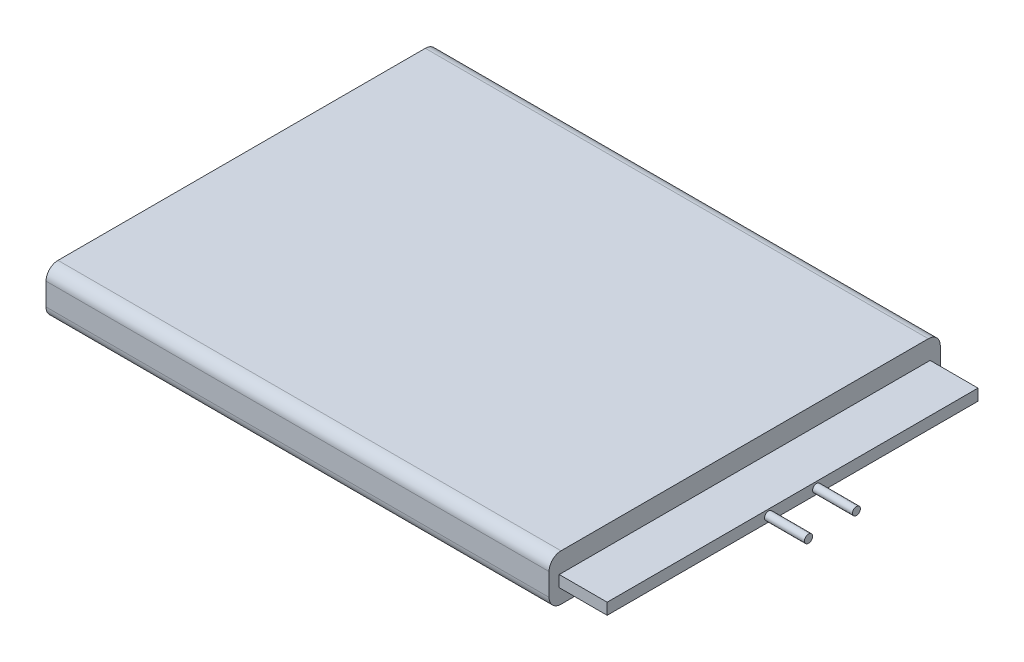
ISO-10303-21;
HEADER;
FILE_DESCRIPTION(('STEP AP214'),'2;1');
FILE_NAME('part.step','',(''),(''),'','','');
FILE_SCHEMA(('AUTOMOTIVE_DESIGN { 1 0 10303 214 1 1 1 1 }'));
ENDSEC;
DATA;
#1=APPLICATION_CONTEXT('core data for automotive mechanical design processes');
#2=APPLICATION_PROTOCOL_DEFINITION('international standard','automotive_design',2000,#1);
#3=PRODUCT_CONTEXT('',#1,'mechanical');
#4=PRODUCT('Part','Part','',(#3));
#5=PRODUCT_RELATED_PRODUCT_CATEGORY('part','',(#4));
#6=PRODUCT_DEFINITION_FORMATION('','',#4);
#7=PRODUCT_DEFINITION_CONTEXT('part definition',#1,'design');
#8=PRODUCT_DEFINITION('design','',#6,#7);
#9=PRODUCT_DEFINITION_SHAPE('','',#8);
#10=(LENGTH_UNIT() NAMED_UNIT(*) SI_UNIT(.MILLI.,.METRE.));
#11=(NAMED_UNIT(*) PLANE_ANGLE_UNIT() SI_UNIT($,.RADIAN.));
#12=(NAMED_UNIT(*) SI_UNIT($,.STERADIAN.) SOLID_ANGLE_UNIT());
#13=UNCERTAINTY_MEASURE_WITH_UNIT(LENGTH_MEASURE(1.E-05),#10,'distance_accuracy_value','');
#14=(GEOMETRIC_REPRESENTATION_CONTEXT(3) GLOBAL_UNCERTAINTY_ASSIGNED_CONTEXT((#13)) GLOBAL_UNIT_ASSIGNED_CONTEXT((#10,
#11,#12)) REPRESENTATION_CONTEXT('',''));
#15=CARTESIAN_POINT('',(0.,0.,0.));
#16=DIRECTION('',(0.,0.,1.));
#17=DIRECTION('',(1.,0.,0.));
#18=AXIS2_PLACEMENT_3D('',#15,#16,#17);
#19=CARTESIAN_POINT('',(63.,5.8,0.));
#20=DIRECTION('',(-1.,0.,0.));
#21=DIRECTION('',(0.,0.,1.));
#22=AXIS2_PLACEMENT_3D('',#19,#20,#21);
#23=PLANE('',#22);
#24=DIRECTION('',(0.,0.,-1.));
#25=VECTOR('',#24,1.);
#26=CARTESIAN_POINT('',(63.,0.,0.));
#27=LINE('',#26,#25);
#28=CARTESIAN_POINT('',(63.,0.,-1.5));
#29=VERTEX_POINT('',#28);
#30=CARTESIAN_POINT('',(63.,0.,-47.5));
#31=VERTEX_POINT('',#30);
#32=EDGE_CURVE('E144',#29,#31,#27,.T.);
#33=ORIENTED_EDGE('',*,*,#32,.T.);
#34=CARTESIAN_POINT('',(63.,1.5,-47.5));
#35=DIRECTION('',(-1.,0.,0.));
#36=DIRECTION('',(0.,0.,1.));
#37=AXIS2_PLACEMENT_3D('',#34,#35,#36);
#38=CIRCLE('',#37,1.5);
#39=CARTESIAN_POINT('',(63.,1.5,-49.));
#40=VERTEX_POINT('',#39);
#41=EDGE_CURVE('E193',#31,#40,#38,.F.);
#42=ORIENTED_EDGE('',*,*,#41,.T.);
#43=DIRECTION('',(0.,-1.,0.));
#44=VECTOR('',#43,1.);
#45=CARTESIAN_POINT('',(63.,5.8,-49.));
#46=LINE('',#45,#44);
#47=CARTESIAN_POINT('',(63.,4.3,-49.));
#48=VERTEX_POINT('',#47);
#49=EDGE_CURVE('E161',#48,#40,#46,.T.);
#50=ORIENTED_EDGE('',*,*,#49,.F.);
#51=CARTESIAN_POINT('',(63.,4.3,-47.5));
#52=DIRECTION('',(-1.,0.,0.));
#53=DIRECTION('',(0.,0.,1.));
#54=AXIS2_PLACEMENT_3D('',#51,#52,#53);
#55=CIRCLE('',#54,1.5);
#56=CARTESIAN_POINT('',(63.,5.8,-47.5));
#57=VERTEX_POINT('',#56);
#58=EDGE_CURVE('E191',#48,#57,#55,.F.);
#59=ORIENTED_EDGE('',*,*,#58,.T.);
#60=DIRECTION('',(0.,0.,-1.));
#61=VECTOR('',#60,1.);
#62=CARTESIAN_POINT('',(63.,5.8,0.));
#63=LINE('',#62,#61);
#64=CARTESIAN_POINT('',(63.,5.8,-1.5));
#65=VERTEX_POINT('',#64);
#66=EDGE_CURVE('E153',#65,#57,#63,.T.);
#67=ORIENTED_EDGE('',*,*,#66,.F.);
#68=CARTESIAN_POINT('',(63.,4.3,-1.5));
#69=DIRECTION('',(-1.,0.,0.));
#70=DIRECTION('',(0.,0.,1.));
#71=AXIS2_PLACEMENT_3D('',#68,#69,#70);
#72=CIRCLE('',#71,1.5);
#73=CARTESIAN_POINT('',(63.,4.3,0.));
#74=VERTEX_POINT('',#73);
#75=EDGE_CURVE('E187',#65,#74,#72,.F.);
#76=ORIENTED_EDGE('',*,*,#75,.T.);
#77=DIRECTION('',(0.,-1.,0.));
#78=VECTOR('',#77,1.);
#79=CARTESIAN_POINT('',(63.,5.8,0.));
#80=LINE('',#79,#78);
#81=CARTESIAN_POINT('',(63.,1.5,0.));
#82=VERTEX_POINT('',#81);
#83=EDGE_CURVE('E164',#74,#82,#80,.T.);
#84=ORIENTED_EDGE('',*,*,#83,.T.);
#85=CARTESIAN_POINT('',(63.,1.5,-1.5));
#86=DIRECTION('',(-1.,0.,0.));
#87=DIRECTION('',(0.,0.,1.));
#88=AXIS2_PLACEMENT_3D('',#85,#86,#87);
#89=CIRCLE('',#88,1.5);
#90=EDGE_CURVE('E189',#82,#29,#89,.F.);
#91=ORIENTED_EDGE('',*,*,#90,.T.);
#92=EDGE_LOOP('',(#33,#42,#50,#59,#67,#76,#84,#91));
#93=FACE_BOUND('',#92,.T.);
#94=DIRECTION('',(0.,1.,0.));
#95=VECTOR('',#94,1.);
#96=CARTESIAN_POINT('',(63.,3.33590435886056,-47.7218140265596));
#97=LINE('',#96,#95);
#98=CARTESIAN_POINT('',(63.,1.90930827531764,-47.7218140265596));
#99=VERTEX_POINT('',#98);
#100=CARTESIAN_POINT('',(63.,3.33590435886056,-47.7218140265596));
#101=VERTEX_POINT('',#100);
#102=EDGE_CURVE('E47',#99,#101,#97,.T.);
#103=ORIENTED_EDGE('',*,*,#102,.F.);
#104=DIRECTION('',(0.,0.,-1.));
#105=VECTOR('',#104,1.);
#106=CARTESIAN_POINT('',(63.,1.90930827531764,-1.2781859734404));
#107=LINE('',#106,#105);
#108=CARTESIAN_POINT('',(63.,1.90930827531764,-1.2781859734404));
#109=VERTEX_POINT('',#108);
#110=EDGE_CURVE('E51',#109,#99,#107,.T.);
#111=ORIENTED_EDGE('',*,*,#110,.F.);
#112=DIRECTION('',(0.,-1.,0.));
#113=VECTOR('',#112,1.);
#114=CARTESIAN_POINT('',(63.,3.33590435886056,-1.2781859734404));
#115=LINE('',#114,#113);
#116=CARTESIAN_POINT('',(63.,3.33590435886056,-1.2781859734404));
#117=VERTEX_POINT('',#116);
#118=EDGE_CURVE('E316',#117,#109,#115,.T.);
#119=ORIENTED_EDGE('',*,*,#118,.F.);
#120=DIRECTION('',(0.,0.,1.));
#121=VECTOR('',#120,1.);
#122=CARTESIAN_POINT('',(63.,3.33590435886056,-1.2781859734404));
#123=LINE('',#122,#121);
#124=EDGE_CURVE('E314',#101,#117,#123,.T.);
#125=ORIENTED_EDGE('',*,*,#124,.F.);
#126=EDGE_LOOP('',(#103,#111,#119,#125));
#127=FACE_BOUND('',#126,.T.);
#128=ADVANCED_FACE('F32',(#93,#127),#23,.F.);
#129=CARTESIAN_POINT('',(0.,5.8,0.));
#130=DIRECTION('',(1.,0.,0.));
#131=DIRECTION('',(0.,0.,-1.));
#132=AXIS2_PLACEMENT_3D('',#129,#130,#131);
#133=PLANE('',#132);
#134=DIRECTION('',(0.,-1.,0.));
#135=VECTOR('',#134,1.);
#136=CARTESIAN_POINT('',(0.,5.8,-49.));
#137=LINE('',#136,#135);
#138=CARTESIAN_POINT('',(0.,4.3,-49.));
#139=VERTEX_POINT('',#138);
#140=CARTESIAN_POINT('',(0.,1.5,-49.));
#141=VERTEX_POINT('',#140);
#142=EDGE_CURVE('E155',#139,#141,#137,.T.);
#143=ORIENTED_EDGE('',*,*,#142,.T.);
#144=CARTESIAN_POINT('',(0.,1.5,-47.5));
#145=DIRECTION('',(1.,0.,0.));
#146=DIRECTION('',(0.,0.,-1.));
#147=AXIS2_PLACEMENT_3D('',#144,#145,#146);
#148=CIRCLE('',#147,1.5);
#149=CARTESIAN_POINT('',(0.,0.,-47.5));
#150=VERTEX_POINT('',#149);
#151=EDGE_CURVE('E181',#141,#150,#148,.F.);
#152=ORIENTED_EDGE('',*,*,#151,.T.);
#153=DIRECTION('',(0.,0.,1.));
#154=VECTOR('',#153,1.);
#155=CARTESIAN_POINT('',(0.,0.,0.));
#156=LINE('',#155,#154);
#157=CARTESIAN_POINT('',(0.,0.,-1.5));
#158=VERTEX_POINT('',#157);
#159=EDGE_CURVE('E141',#150,#158,#156,.T.);
#160=ORIENTED_EDGE('',*,*,#159,.T.);
#161=CARTESIAN_POINT('',(0.,1.5,-1.5));
#162=DIRECTION('',(1.,0.,0.));
#163=DIRECTION('',(0.,0.,-1.));
#164=AXIS2_PLACEMENT_3D('',#161,#162,#163);
#165=CIRCLE('',#164,1.5);
#166=CARTESIAN_POINT('',(0.,1.5,0.));
#167=VERTEX_POINT('',#166);
#168=EDGE_CURVE('E177',#158,#167,#165,.F.);
#169=ORIENTED_EDGE('',*,*,#168,.T.);
#170=DIRECTION('',(0.,-1.,0.));
#171=VECTOR('',#170,1.);
#172=CARTESIAN_POINT('',(0.,5.8,0.));
#173=LINE('',#172,#171);
#174=CARTESIAN_POINT('',(0.,4.3,0.));
#175=VERTEX_POINT('',#174);
#176=EDGE_CURVE('E167',#175,#167,#173,.T.);
#177=ORIENTED_EDGE('',*,*,#176,.F.);
#178=CARTESIAN_POINT('',(0.,4.3,-1.5));
#179=DIRECTION('',(1.,0.,0.));
#180=DIRECTION('',(0.,0.,-1.));
#181=AXIS2_PLACEMENT_3D('',#178,#179,#180);
#182=CIRCLE('',#181,1.5);
#183=CARTESIAN_POINT('',(0.,5.8,-1.5));
#184=VERTEX_POINT('',#183);
#185=EDGE_CURVE('E175',#175,#184,#182,.F.);
#186=ORIENTED_EDGE('',*,*,#185,.T.);
#187=DIRECTION('',(0.,0.,1.));
#188=VECTOR('',#187,1.);
#189=CARTESIAN_POINT('',(0.,5.8,0.));
#190=LINE('',#189,#188);
#191=CARTESIAN_POINT('',(0.,5.8,-47.5));
#192=VERTEX_POINT('',#191);
#193=EDGE_CURVE('E150',#192,#184,#190,.T.);
#194=ORIENTED_EDGE('',*,*,#193,.F.);
#195=CARTESIAN_POINT('',(0.,4.3,-47.5));
#196=DIRECTION('',(1.,0.,0.));
#197=DIRECTION('',(0.,0.,-1.));
#198=AXIS2_PLACEMENT_3D('',#195,#196,#197);
#199=CIRCLE('',#198,1.5);
#200=EDGE_CURVE('E179',#192,#139,#199,.F.);
#201=ORIENTED_EDGE('',*,*,#200,.T.);
#202=EDGE_LOOP('',(#143,#152,#160,#169,#177,#186,#194,#201));
#203=FACE_BOUND('',#202,.T.);
#204=ADVANCED_FACE('F209',(#203),#133,.F.);
#205=CARTESIAN_POINT('',(0.,5.8,0.));
#206=DIRECTION('',(0.,0.,-1.));
#207=DIRECTION('',(-1.,0.,0.));
#208=AXIS2_PLACEMENT_3D('',#205,#206,#207);
#209=PLANE('',#208);
#210=ORIENTED_EDGE('',*,*,#176,.T.);
#211=DIRECTION('',(1.,0.,0.));
#212=VECTOR('',#211,1.);
#213=CARTESIAN_POINT('',(63.,1.5,0.));
#214=LINE('',#213,#212);
#215=EDGE_CURVE('E11',#167,#82,#214,.T.);
#216=ORIENTED_EDGE('',*,*,#215,.T.);
#217=ORIENTED_EDGE('',*,*,#83,.F.);
#218=DIRECTION('',(1.,0.,0.));
#219=VECTOR('',#218,1.);
#220=CARTESIAN_POINT('',(0.,4.3,0.));
#221=LINE('',#220,#219);
#222=EDGE_CURVE('E40',#74,#175,#221,.F.);
#223=ORIENTED_EDGE('',*,*,#222,.T.);
#224=EDGE_LOOP('',(#210,#216,#217,#223));
#225=FACE_BOUND('',#224,.T.);
#226=ADVANCED_FACE('F204',(#225),#209,.F.);
#227=CARTESIAN_POINT('',(0.,5.8,-49.));
#228=DIRECTION('',(0.,0.,1.));
#229=DIRECTION('',(1.,0.,0.));
#230=AXIS2_PLACEMENT_3D('',#227,#228,#229);
#231=PLANE('',#230);
#232=ORIENTED_EDGE('',*,*,#49,.T.);
#233=DIRECTION('',(-1.,0.,0.));
#234=VECTOR('',#233,1.);
#235=CARTESIAN_POINT('',(0.,1.5,-49.));
#236=LINE('',#235,#234);
#237=EDGE_CURVE('E172',#40,#141,#236,.T.);
#238=ORIENTED_EDGE('',*,*,#237,.T.);
#239=ORIENTED_EDGE('',*,*,#142,.F.);
#240=DIRECTION('',(-1.,0.,0.));
#241=VECTOR('',#240,1.);
#242=CARTESIAN_POINT('',(0.,4.3,-49.));
#243=LINE('',#242,#241);
#244=EDGE_CURVE('E170',#139,#48,#243,.F.);
#245=ORIENTED_EDGE('',*,*,#244,.T.);
#246=EDGE_LOOP('',(#232,#238,#239,#245));
#247=FACE_BOUND('',#246,.T.);
#248=ADVANCED_FACE('F225',(#247),#231,.F.);
#249=CARTESIAN_POINT('',(0.,5.8,0.));
#250=DIRECTION('',(0.,-1.,0.));
#251=DIRECTION('',(0.,0.,-1.));
#252=AXIS2_PLACEMENT_3D('',#249,#250,#251);
#253=PLANE('',#252);
#254=ORIENTED_EDGE('',*,*,#66,.T.);
#255=DIRECTION('',(-1.,0.,0.));
#256=VECTOR('',#255,1.);
#257=CARTESIAN_POINT('',(0.,5.8,-47.5));
#258=LINE('',#257,#256);
#259=EDGE_CURVE('E198',#57,#192,#258,.T.);
#260=ORIENTED_EDGE('',*,*,#259,.T.);
#261=ORIENTED_EDGE('',*,*,#193,.T.);
#262=DIRECTION('',(1.,0.,0.));
#263=VECTOR('',#262,1.);
#264=CARTESIAN_POINT('',(0.,5.8,-1.5));
#265=LINE('',#264,#263);
#266=EDGE_CURVE('E195',#184,#65,#265,.T.);
#267=ORIENTED_EDGE('',*,*,#266,.T.);
#268=EDGE_LOOP('',(#254,#260,#261,#267));
#269=FACE_BOUND('',#268,.T.);
#270=ADVANCED_FACE('F215',(#269),#253,.F.);
#271=CARTESIAN_POINT('',(0.,0.,0.));
#272=DIRECTION('',(0.,-1.,0.));
#273=DIRECTION('',(0.,0.,-1.));
#274=AXIS2_PLACEMENT_3D('',#271,#272,#273);
#275=PLANE('',#274);
#276=ORIENTED_EDGE('',*,*,#159,.F.);
#277=DIRECTION('',(-1.,0.,0.));
#278=VECTOR('',#277,1.);
#279=CARTESIAN_POINT('',(63.,0.,-47.5));
#280=LINE('',#279,#278);
#281=EDGE_CURVE('E185',#150,#31,#280,.F.);
#282=ORIENTED_EDGE('',*,*,#281,.T.);
#283=ORIENTED_EDGE('',*,*,#32,.F.);
#284=DIRECTION('',(1.,0.,0.));
#285=VECTOR('',#284,1.);
#286=CARTESIAN_POINT('',(0.,0.,-1.5));
#287=LINE('',#286,#285);
#288=EDGE_CURVE('E183',#29,#158,#287,.F.);
#289=ORIENTED_EDGE('',*,*,#288,.T.);
#290=EDGE_LOOP('',(#276,#282,#283,#289));
#291=FACE_BOUND('',#290,.T.);
#292=ADVANCED_FACE('F233',(#291),#275,.T.);
#293=CARTESIAN_POINT('',(0.,1.5,-47.5));
#294=DIRECTION('',(1.,0.,0.));
#295=DIRECTION('',(0.,0.,-1.));
#296=AXIS2_PLACEMENT_3D('',#293,#294,#295);
#297=CYLINDRICAL_SURFACE('',#296,1.5);
#298=ORIENTED_EDGE('',*,*,#41,.F.);
#299=ORIENTED_EDGE('',*,*,#281,.F.);
#300=ORIENTED_EDGE('',*,*,#151,.F.);
#301=ORIENTED_EDGE('',*,*,#237,.F.);
#302=EDGE_LOOP('',(#298,#299,#300,#301));
#303=FACE_BOUND('',#302,.T.);
#304=ADVANCED_FACE('F229',(#303),#297,.T.);
#305=CARTESIAN_POINT('',(0.,4.3,-47.5));
#306=DIRECTION('',(-1.,0.,0.));
#307=DIRECTION('',(0.,0.,1.));
#308=AXIS2_PLACEMENT_3D('',#305,#306,#307);
#309=CYLINDRICAL_SURFACE('',#308,1.5);
#310=ORIENTED_EDGE('',*,*,#58,.F.);
#311=ORIENTED_EDGE('',*,*,#244,.F.);
#312=ORIENTED_EDGE('',*,*,#200,.F.);
#313=ORIENTED_EDGE('',*,*,#259,.F.);
#314=EDGE_LOOP('',(#310,#311,#312,#313));
#315=FACE_BOUND('',#314,.T.);
#316=ADVANCED_FACE('F222',(#315),#309,.T.);
#317=CARTESIAN_POINT('',(0.,1.5,-1.5));
#318=DIRECTION('',(-1.,0.,0.));
#319=DIRECTION('',(0.,0.,1.));
#320=AXIS2_PLACEMENT_3D('',#317,#318,#319);
#321=CYLINDRICAL_SURFACE('',#320,1.5);
#322=ORIENTED_EDGE('',*,*,#168,.F.);
#323=ORIENTED_EDGE('',*,*,#288,.F.);
#324=ORIENTED_EDGE('',*,*,#90,.F.);
#325=ORIENTED_EDGE('',*,*,#215,.F.);
#326=EDGE_LOOP('',(#322,#323,#324,#325));
#327=FACE_BOUND('',#326,.T.);
#328=ADVANCED_FACE('F237',(#327),#321,.T.);
#329=CARTESIAN_POINT('',(0.,4.3,-1.5));
#330=DIRECTION('',(1.,0.,0.));
#331=DIRECTION('',(0.,0.,-1.));
#332=AXIS2_PLACEMENT_3D('',#329,#330,#331);
#333=CYLINDRICAL_SURFACE('',#332,1.5);
#334=ORIENTED_EDGE('',*,*,#185,.F.);
#335=ORIENTED_EDGE('',*,*,#222,.F.);
#336=ORIENTED_EDGE('',*,*,#75,.F.);
#337=ORIENTED_EDGE('',*,*,#266,.F.);
#338=EDGE_LOOP('',(#334,#335,#336,#337));
#339=FACE_BOUND('',#338,.T.);
#340=ADVANCED_FACE('F34',(#339),#333,.T.);
#341=CARTESIAN_POINT('',(69.,3.33590435886056,-47.7218140265596));
#342=DIRECTION('',(0.,0.,1.));
#343=DIRECTION('',(1.,0.,0.));
#344=AXIS2_PLACEMENT_3D('',#341,#342,#343);
#345=PLANE('',#344);
#346=ORIENTED_EDGE('',*,*,#102,.T.);
#347=DIRECTION('',(-1.,0.,0.));
#348=VECTOR('',#347,1.);
#349=CARTESIAN_POINT('',(69.,3.33590435886056,-47.7218140265596));
#350=LINE('',#349,#348);
#351=CARTESIAN_POINT('',(69.,3.33590435886056,-47.7218140265596));
#352=VERTEX_POINT('',#351);
#353=EDGE_CURVE('E124',#352,#101,#350,.T.);
#354=ORIENTED_EDGE('',*,*,#353,.F.);
#355=DIRECTION('',(0.,1.,0.));
#356=VECTOR('',#355,1.);
#357=CARTESIAN_POINT('',(69.,3.33590435886056,-47.7218140265596));
#358=LINE('',#357,#356);
#359=CARTESIAN_POINT('',(69.,1.90930827531764,-47.7218140265596));
#360=VERTEX_POINT('',#359);
#361=EDGE_CURVE('E130',#360,#352,#358,.T.);
#362=ORIENTED_EDGE('',*,*,#361,.F.);
#363=DIRECTION('',(-1.,0.,0.));
#364=VECTOR('',#363,1.);
#365=CARTESIAN_POINT('',(69.,1.90930827531764,-47.7218140265596));
#366=LINE('',#365,#364);
#367=EDGE_CURVE('E312',#360,#99,#366,.T.);
#368=ORIENTED_EDGE('',*,*,#367,.T.);
#369=EDGE_LOOP('',(#346,#354,#362,#368));
#370=FACE_BOUND('',#369,.T.);
#371=ADVANCED_FACE('F140',(#370),#345,.F.);
#372=CARTESIAN_POINT('',(69.,3.33590435886056,-1.2781859734404));
#373=DIRECTION('',(0.,-1.,0.));
#374=DIRECTION('',(0.,0.,-1.));
#375=AXIS2_PLACEMENT_3D('',#372,#373,#374);
#376=PLANE('',#375);
#377=ORIENTED_EDGE('',*,*,#124,.T.);
#378=DIRECTION('',(-1.,0.,0.));
#379=VECTOR('',#378,1.);
#380=CARTESIAN_POINT('',(69.,3.33590435886056,-1.2781859734404));
#381=LINE('',#380,#379);
#382=CARTESIAN_POINT('',(69.,3.33590435886056,-1.2781859734404));
#383=VERTEX_POINT('',#382);
#384=EDGE_CURVE('E126',#383,#117,#381,.T.);
#385=ORIENTED_EDGE('',*,*,#384,.F.);
#386=DIRECTION('',(0.,0.,1.));
#387=VECTOR('',#386,1.);
#388=CARTESIAN_POINT('',(69.,3.33590435886056,-1.2781859734404));
#389=LINE('',#388,#387);
#390=EDGE_CURVE('E119',#352,#383,#389,.T.);
#391=ORIENTED_EDGE('',*,*,#390,.F.);
#392=ORIENTED_EDGE('',*,*,#353,.T.);
#393=EDGE_LOOP('',(#377,#385,#391,#392));
#394=FACE_BOUND('',#393,.T.);
#395=ADVANCED_FACE('F122',(#394),#376,.F.);
#396=CARTESIAN_POINT('',(69.,3.33590435886056,-1.2781859734404));
#397=DIRECTION('',(0.,0.,-1.));
#398=DIRECTION('',(0.,1.,0.));
#399=AXIS2_PLACEMENT_3D('',#396,#397,#398);
#400=PLANE('',#399);
#401=ORIENTED_EDGE('',*,*,#118,.T.);
#402=DIRECTION('',(-1.,0.,0.));
#403=VECTOR('',#402,1.);
#404=CARTESIAN_POINT('',(69.,1.90930827531764,-1.2781859734404));
#405=LINE('',#404,#403);
#406=CARTESIAN_POINT('',(69.,1.90930827531764,-1.2781859734404));
#407=VERTEX_POINT('',#406);
#408=EDGE_CURVE('E146',#407,#109,#405,.T.);
#409=ORIENTED_EDGE('',*,*,#408,.F.);
#410=DIRECTION('',(0.,-1.,0.));
#411=VECTOR('',#410,1.);
#412=CARTESIAN_POINT('',(69.,3.33590435886056,-1.2781859734404));
#413=LINE('',#412,#411);
#414=EDGE_CURVE('E129',#383,#407,#413,.T.);
#415=ORIENTED_EDGE('',*,*,#414,.F.);
#416=ORIENTED_EDGE('',*,*,#384,.T.);
#417=EDGE_LOOP('',(#401,#409,#415,#416));
#418=FACE_BOUND('',#417,.T.);
#419=ADVANCED_FACE('F268',(#418),#400,.F.);
#420=CARTESIAN_POINT('',(69.,1.90930827531764,-1.2781859734404));
#421=DIRECTION('',(0.,1.,0.));
#422=DIRECTION('',(0.,0.,1.));
#423=AXIS2_PLACEMENT_3D('',#420,#421,#422);
#424=PLANE('',#423);
#425=ORIENTED_EDGE('',*,*,#110,.T.);
#426=ORIENTED_EDGE('',*,*,#367,.F.);
#427=DIRECTION('',(0.,0.,-1.));
#428=VECTOR('',#427,1.);
#429=CARTESIAN_POINT('',(69.,1.90930827531764,-1.2781859734404));
#430=LINE('',#429,#428);
#431=EDGE_CURVE('E135',#407,#360,#430,.T.);
#432=ORIENTED_EDGE('',*,*,#431,.F.);
#433=ORIENTED_EDGE('',*,*,#408,.T.);
#434=EDGE_LOOP('',(#425,#426,#432,#433));
#435=FACE_BOUND('',#434,.T.);
#436=ADVANCED_FACE('F271',(#435),#424,.F.);
#437=CARTESIAN_POINT('',(69.,0.,0.));
#438=DIRECTION('',(1.,0.,0.));
#439=DIRECTION('',(0.,0.,-1.));
#440=AXIS2_PLACEMENT_3D('',#437,#438,#439);
#441=PLANE('',#440);
#442=CARTESIAN_POINT('',(69.,2.61638556578703,-27.5));
#443=DIRECTION('',(1.,0.,0.));
#444=DIRECTION('',(0.,0.,-1.));
#445=AXIS2_PLACEMENT_3D('',#442,#443,#444);
#446=CIRCLE('',#445,0.496056103718526);
#447=CARTESIAN_POINT('',(69.,2.61638556578703,-27.9960561037185));
#448=VERTEX_POINT('',#447);
#449=EDGE_CURVE('E300',#448,#448,#446,.T.);
#450=ORIENTED_EDGE('',*,*,#449,.F.);
#451=EDGE_LOOP('',(#450));
#452=FACE_BOUND('',#451,.T.);
#453=CARTESIAN_POINT('',(69.,2.61638556578703,-21.5));
#454=DIRECTION('',(1.,0.,0.));
#455=DIRECTION('',(0.,0.,-1.));
#456=AXIS2_PLACEMENT_3D('',#453,#454,#455);
#457=CIRCLE('',#456,0.510026016897933);
#458=CARTESIAN_POINT('',(69.,2.61638556578703,-22.0100260168979));
#459=VERTEX_POINT('',#458);
#460=EDGE_CURVE('E299',#459,#459,#457,.T.);
#461=ORIENTED_EDGE('',*,*,#460,.F.);
#462=EDGE_LOOP('',(#461));
#463=FACE_BOUND('',#462,.T.);
#464=ORIENTED_EDGE('',*,*,#361,.T.);
#465=ORIENTED_EDGE('',*,*,#390,.T.);
#466=ORIENTED_EDGE('',*,*,#414,.T.);
#467=ORIENTED_EDGE('',*,*,#431,.T.);
#468=EDGE_LOOP('',(#464,#465,#466,#467));
#469=FACE_BOUND('',#468,.T.);
#470=ADVANCED_FACE('F133',(#452,#463,#469),#441,.T.);
#471=CARTESIAN_POINT('',(74.,2.61638556578703,-21.5));
#472=DIRECTION('',(-1.,0.,0.));
#473=DIRECTION('',(0.,0.,1.));
#474=AXIS2_PLACEMENT_3D('',#471,#472,#473);
#475=CYLINDRICAL_SURFACE('',#474,0.510026016897933);
#476=CARTESIAN_POINT('',(74.,2.61638556578703,-21.5));
#477=DIRECTION('',(1.,0.,0.));
#478=DIRECTION('',(0.,0.,-1.));
#479=AXIS2_PLACEMENT_3D('',#476,#477,#478);
#480=CIRCLE('',#479,0.510026016897933);
#481=CARTESIAN_POINT('',(74.,2.61638556578703,-22.0100260168979));
#482=VERTEX_POINT('',#481);
#483=EDGE_CURVE('E303',#482,#482,#480,.T.);
#484=ORIENTED_EDGE('',*,*,#483,.F.);
#485=EDGE_LOOP('',(#484));
#486=FACE_BOUND('',#485,.T.);
#487=ORIENTED_EDGE('',*,*,#460,.T.);
#488=EDGE_LOOP('',(#487));
#489=FACE_BOUND('',#488,.T.);
#490=ADVANCED_FACE('F278',(#486,#489),#475,.T.);
#491=CARTESIAN_POINT('',(74.,2.61638556578703,-21.5));
#492=DIRECTION('',(1.,0.,0.));
#493=DIRECTION('',(0.,0.,-1.));
#494=AXIS2_PLACEMENT_3D('',#491,#492,#493);
#495=PLANE('',#494);
#496=ORIENTED_EDGE('',*,*,#483,.T.);
#497=EDGE_LOOP('',(#496));
#498=FACE_BOUND('',#497,.T.);
#499=ADVANCED_FACE('F282',(#498),#495,.T.);
#500=CARTESIAN_POINT('',(74.,2.61638556578703,-27.5));
#501=DIRECTION('',(-1.,0.,0.));
#502=DIRECTION('',(0.,0.,1.));
#503=AXIS2_PLACEMENT_3D('',#500,#501,#502);
#504=CYLINDRICAL_SURFACE('',#503,0.496056103718526);
#505=CARTESIAN_POINT('',(74.,2.61638556578703,-27.5));
#506=DIRECTION('',(1.,0.,0.));
#507=DIRECTION('',(0.,0.,-1.));
#508=AXIS2_PLACEMENT_3D('',#505,#506,#507);
#509=CIRCLE('',#508,0.496056103718526);
#510=CARTESIAN_POINT('',(74.,2.61638556578703,-27.9960561037185));
#511=VERTEX_POINT('',#510);
#512=EDGE_CURVE('E298',#511,#511,#509,.T.);
#513=ORIENTED_EDGE('',*,*,#512,.F.);
#514=EDGE_LOOP('',(#513));
#515=FACE_BOUND('',#514,.T.);
#516=ORIENTED_EDGE('',*,*,#449,.T.);
#517=EDGE_LOOP('',(#516));
#518=FACE_BOUND('',#517,.T.);
#519=ADVANCED_FACE('F286',(#515,#518),#504,.T.);
#520=CARTESIAN_POINT('',(74.,2.61638556578703,-27.5));
#521=DIRECTION('',(1.,0.,0.));
#522=DIRECTION('',(0.,0.,-1.));
#523=AXIS2_PLACEMENT_3D('',#520,#521,#522);
#524=PLANE('',#523);
#525=ORIENTED_EDGE('',*,*,#512,.T.);
#526=EDGE_LOOP('',(#525));
#527=FACE_BOUND('',#526,.T.);
#528=ADVANCED_FACE('F290',(#527),#524,.T.);
#529=CLOSED_SHELL('',(#128,#204,#226,#248,#270,#292,#304,#316,#328,#340,#371,#395,#419,#436,
#470,#490,#499,#519,#528));
#530=MANIFOLD_SOLID_BREP('B2',#529);
#531=ADVANCED_BREP_SHAPE_REPRESENTATION('',(#18,#530),#14);
#532=SHAPE_DEFINITION_REPRESENTATION(#9,#531);
ENDSEC;
END-ISO-10303-21;
